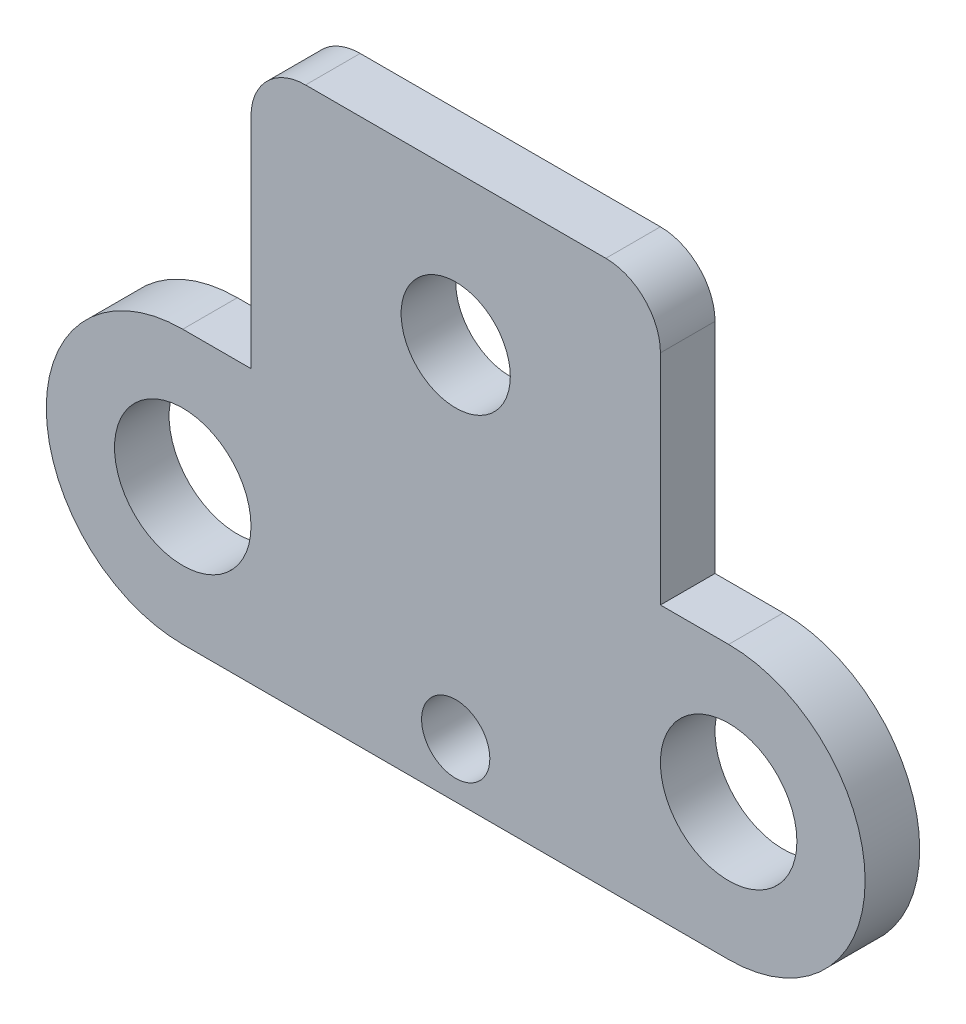
ISO-10303-21;
HEADER;
FILE_DESCRIPTION(('STEP AP214'),'2;1');
FILE_NAME('part.step','',(''),(''),'','','');
FILE_SCHEMA(('AUTOMOTIVE_DESIGN { 1 0 10303 214 1 1 1 1 }'));
ENDSEC;
DATA;
#1=APPLICATION_CONTEXT('core data for automotive mechanical design processes');
#2=APPLICATION_PROTOCOL_DEFINITION('international standard','automotive_design',2000,#1);
#3=PRODUCT_CONTEXT('',#1,'mechanical');
#4=PRODUCT('Part','Part','',(#3));
#5=PRODUCT_RELATED_PRODUCT_CATEGORY('part','',(#4));
#6=PRODUCT_DEFINITION_FORMATION('','',#4);
#7=PRODUCT_DEFINITION_CONTEXT('part definition',#1,'design');
#8=PRODUCT_DEFINITION('design','',#6,#7);
#9=PRODUCT_DEFINITION_SHAPE('','',#8);
#10=(LENGTH_UNIT() NAMED_UNIT(*) SI_UNIT(.MILLI.,.METRE.));
#11=(NAMED_UNIT(*) PLANE_ANGLE_UNIT() SI_UNIT($,.RADIAN.));
#12=(NAMED_UNIT(*) SI_UNIT($,.STERADIAN.) SOLID_ANGLE_UNIT());
#13=UNCERTAINTY_MEASURE_WITH_UNIT(LENGTH_MEASURE(1.E-05),#10,'distance_accuracy_value','');
#14=(GEOMETRIC_REPRESENTATION_CONTEXT(3) GLOBAL_UNCERTAINTY_ASSIGNED_CONTEXT((#13)) GLOBAL_UNIT_ASSIGNED_CONTEXT((#10,
#11,#12)) REPRESENTATION_CONTEXT('',''));
#15=CARTESIAN_POINT('',(0.,0.,0.));
#16=DIRECTION('',(0.,0.,1.));
#17=DIRECTION('',(1.,0.,0.));
#18=AXIS2_PLACEMENT_3D('',#15,#16,#17);
#19=CARTESIAN_POINT('',(0.,5.,1.));
#20=DIRECTION('',(0.,-1.,0.));
#21=DIRECTION('',(0.,0.,-1.));
#22=AXIS2_PLACEMENT_3D('',#19,#20,#21);
#23=PLANE('',#22);
#24=DIRECTION('',(0.,0.,-1.));
#25=VECTOR('',#24,1.);
#26=CARTESIAN_POINT('',(2.5,5.,1.));
#27=LINE('',#26,#25);
#28=CARTESIAN_POINT('',(2.5,5.,1.));
#29=VERTEX_POINT('',#28);
#30=CARTESIAN_POINT('',(2.5,5.,-1.));
#31=VERTEX_POINT('',#30);
#32=EDGE_CURVE('E134',#29,#31,#27,.T.);
#33=ORIENTED_EDGE('',*,*,#32,.T.);
#34=DIRECTION('',(-1.,0.,0.));
#35=VECTOR('',#34,1.);
#36=CARTESIAN_POINT('',(0.,5.,-1.));
#37=LINE('',#36,#35);
#38=CARTESIAN_POINT('',(0.,5.,-1.));
#39=VERTEX_POINT('',#38);
#40=EDGE_CURVE('E129',#31,#39,#37,.T.);
#41=ORIENTED_EDGE('',*,*,#40,.T.);
#42=DIRECTION('',(0.,0.,-1.));
#43=VECTOR('',#42,1.);
#44=CARTESIAN_POINT('',(0.,5.,1.));
#45=LINE('',#44,#43);
#46=CARTESIAN_POINT('',(0.,5.,1.));
#47=VERTEX_POINT('',#46);
#48=EDGE_CURVE('E181',#47,#39,#45,.T.);
#49=ORIENTED_EDGE('',*,*,#48,.F.);
#50=DIRECTION('',(-1.,0.,0.));
#51=VECTOR('',#50,1.);
#52=CARTESIAN_POINT('',(0.,5.,1.));
#53=LINE('',#52,#51);
#54=EDGE_CURVE('E178',#29,#47,#53,.T.);
#55=ORIENTED_EDGE('',*,*,#54,.F.);
#56=EDGE_LOOP('',(#33,#41,#49,#55));
#57=FACE_BOUND('',#56,.T.);
#58=ADVANCED_FACE('F37',(#57),#23,.F.);
#59=DIRECTION('',(0.,0.,-1.));
#60=VECTOR('',#59,1.);
#61=CARTESIAN_POINT('',(17.5,5.,1.));
#62=LINE('',#61,#60);
#63=CARTESIAN_POINT('',(17.5,5.,1.));
#64=VERTEX_POINT('',#63);
#65=CARTESIAN_POINT('',(17.5,5.,-1.));
#66=VERTEX_POINT('',#65);
#67=EDGE_CURVE('E121',#64,#66,#62,.T.);
#68=ORIENTED_EDGE('',*,*,#67,.F.);
#69=CARTESIAN_POINT('',(20.,5.,1.));
#70=VERTEX_POINT('',#69);
#71=EDGE_CURVE('E179',#70,#64,#53,.T.);
#72=ORIENTED_EDGE('',*,*,#71,.F.);
#73=DIRECTION('',(0.,0.,-1.));
#74=VECTOR('',#73,1.);
#75=CARTESIAN_POINT('',(20.,5.,1.));
#76=LINE('',#75,#74);
#77=CARTESIAN_POINT('',(20.,5.,-1.));
#78=VERTEX_POINT('',#77);
#79=EDGE_CURVE('E124',#70,#78,#76,.T.);
#80=ORIENTED_EDGE('',*,*,#79,.T.);
#81=EDGE_CURVE('E117',#78,#66,#37,.T.);
#82=ORIENTED_EDGE('',*,*,#81,.T.);
#83=EDGE_LOOP('',(#68,#72,#80,#82));
#84=FACE_BOUND('',#83,.T.);
#85=ADVANCED_FACE('F119',(#84),#23,.F.);
#86=CARTESIAN_POINT('',(0.,0.,1.));
#87=DIRECTION('',(0.,0.,1.));
#88=DIRECTION('',(1.,0.,0.));
#89=AXIS2_PLACEMENT_3D('',#86,#87,#88);
#90=PLANE('',#89);
#91=CARTESIAN_POINT('',(20.,0.,1.));
#92=DIRECTION('',(0.,0.,1.));
#93=DIRECTION('',(1.,0.,0.));
#94=AXIS2_PLACEMENT_3D('',#91,#92,#93);
#95=CIRCLE('',#94,2.5);
#96=CARTESIAN_POINT('',(22.5,0.,1.));
#97=VERTEX_POINT('',#96);
#98=EDGE_CURVE('E160',#97,#97,#95,.T.);
#99=ORIENTED_EDGE('',*,*,#98,.F.);
#100=EDGE_LOOP('',(#99));
#101=FACE_BOUND('',#100,.T.);
#102=DIRECTION('',(0.,1.,0.));
#103=VECTOR('',#102,1.);
#104=CARTESIAN_POINT('',(17.5,5.,1.));
#105=LINE('',#104,#103);
#106=CARTESIAN_POINT('',(17.5,13.,1.));
#107=VERTEX_POINT('',#106);
#108=EDGE_CURVE('E133',#64,#107,#105,.T.);
#109=ORIENTED_EDGE('',*,*,#108,.T.);
#110=CARTESIAN_POINT('',(15.5,13.,1.));
#111=DIRECTION('',(0.,0.,1.));
#112=DIRECTION('',(1.,0.,0.));
#113=AXIS2_PLACEMENT_3D('',#110,#111,#112);
#114=CIRCLE('',#113,2.);
#115=CARTESIAN_POINT('',(15.5,15.,1.));
#116=VERTEX_POINT('',#115);
#117=EDGE_CURVE('E45',#107,#116,#114,.T.);
#118=ORIENTED_EDGE('',*,*,#117,.T.);
#119=DIRECTION('',(-1.,0.,0.));
#120=VECTOR('',#119,1.);
#121=CARTESIAN_POINT('',(2.5,15.,1.));
#122=LINE('',#121,#120);
#123=CARTESIAN_POINT('',(4.5,15.,1.));
#124=VERTEX_POINT('',#123);
#125=EDGE_CURVE('E135',#116,#124,#122,.T.);
#126=ORIENTED_EDGE('',*,*,#125,.T.);
#127=CARTESIAN_POINT('',(4.5,13.,1.));
#128=DIRECTION('',(0.,0.,1.));
#129=DIRECTION('',(1.,0.,0.));
#130=AXIS2_PLACEMENT_3D('',#127,#128,#129);
#131=CIRCLE('',#130,2.);
#132=CARTESIAN_POINT('',(2.5,13.,1.));
#133=VERTEX_POINT('',#132);
#134=EDGE_CURVE('E52',#124,#133,#131,.T.);
#135=ORIENTED_EDGE('',*,*,#134,.T.);
#136=DIRECTION('',(0.,-1.,0.));
#137=VECTOR('',#136,1.);
#138=CARTESIAN_POINT('',(2.5,5.,1.));
#139=LINE('',#138,#137);
#140=EDGE_CURVE('E145',#133,#29,#139,.T.);
#141=ORIENTED_EDGE('',*,*,#140,.T.);
#142=ORIENTED_EDGE('',*,*,#54,.T.);
#143=CARTESIAN_POINT('',(0.,0.,1.));
#144=DIRECTION('',(0.,0.,1.));
#145=DIRECTION('',(1.,0.,0.));
#146=AXIS2_PLACEMENT_3D('',#143,#144,#145);
#147=CIRCLE('',#146,5.);
#148=CARTESIAN_POINT('',(0.,-5.,1.));
#149=VERTEX_POINT('',#148);
#150=EDGE_CURVE('E128',#47,#149,#147,.T.);
#151=ORIENTED_EDGE('',*,*,#150,.T.);
#152=DIRECTION('',(1.,0.,0.));
#153=VECTOR('',#152,1.);
#154=CARTESIAN_POINT('',(0.,-5.,1.));
#155=LINE('',#154,#153);
#156=CARTESIAN_POINT('',(20.,-5.,1.));
#157=VERTEX_POINT('',#156);
#158=EDGE_CURVE('E174',#149,#157,#155,.T.);
#159=ORIENTED_EDGE('',*,*,#158,.T.);
#160=CARTESIAN_POINT('',(20.,0.,1.));
#161=DIRECTION('',(0.,0.,1.));
#162=DIRECTION('',(1.,0.,0.));
#163=AXIS2_PLACEMENT_3D('',#160,#161,#162);
#164=CIRCLE('',#163,5.);
#165=EDGE_CURVE('E176',#157,#70,#164,.T.);
#166=ORIENTED_EDGE('',*,*,#165,.T.);
#167=ORIENTED_EDGE('',*,*,#71,.T.);
#168=EDGE_LOOP('',(#109,#118,#126,#135,#141,#142,#151,#159,#166,#167));
#169=FACE_BOUND('',#168,.T.);
#170=CARTESIAN_POINT('',(0.,0.,1.));
#171=DIRECTION('',(0.,0.,1.));
#172=DIRECTION('',(1.,0.,0.));
#173=AXIS2_PLACEMENT_3D('',#170,#171,#172);
#174=CIRCLE('',#173,2.5);
#175=CARTESIAN_POINT('',(2.5,0.,1.));
#176=VERTEX_POINT('',#175);
#177=EDGE_CURVE('E166',#176,#176,#174,.T.);
#178=ORIENTED_EDGE('',*,*,#177,.F.);
#179=EDGE_LOOP('',(#178));
#180=FACE_BOUND('',#179,.T.);
#181=CARTESIAN_POINT('',(10.,-3.,1.));
#182=DIRECTION('',(0.,0.,1.));
#183=DIRECTION('',(1.,0.,0.));
#184=AXIS2_PLACEMENT_3D('',#181,#182,#183);
#185=CIRCLE('',#184,1.25);
#186=CARTESIAN_POINT('',(11.25,-3.,1.));
#187=VERTEX_POINT('',#186);
#188=EDGE_CURVE('E154',#187,#187,#185,.T.);
#189=ORIENTED_EDGE('',*,*,#188,.F.);
#190=EDGE_LOOP('',(#189));
#191=FACE_BOUND('',#190,.T.);
#192=CARTESIAN_POINT('',(10.,9.5,1.));
#193=DIRECTION('',(0.,0.,1.));
#194=DIRECTION('',(1.,0.,0.));
#195=AXIS2_PLACEMENT_3D('',#192,#193,#194);
#196=CIRCLE('',#195,2.);
#197=CARTESIAN_POINT('',(12.,9.5,1.));
#198=VERTEX_POINT('',#197);
#199=EDGE_CURVE('E147',#198,#198,#196,.T.);
#200=ORIENTED_EDGE('',*,*,#199,.F.);
#201=EDGE_LOOP('',(#200));
#202=FACE_BOUND('',#201,.T.);
#203=ADVANCED_FACE('F208',(#101,#169,#180,#191,#202),#90,.T.);
#204=CARTESIAN_POINT('',(0.,0.,-1.));
#205=DIRECTION('',(0.,0.,1.));
#206=DIRECTION('',(1.,0.,0.));
#207=AXIS2_PLACEMENT_3D('',#204,#205,#206);
#208=PLANE('',#207);
#209=DIRECTION('',(-1.,0.,0.));
#210=VECTOR('',#209,1.);
#211=CARTESIAN_POINT('',(2.5,15.,-1.));
#212=LINE('',#211,#210);
#213=CARTESIAN_POINT('',(15.5,15.,-1.));
#214=VERTEX_POINT('',#213);
#215=CARTESIAN_POINT('',(4.5,15.,-1.));
#216=VERTEX_POINT('',#215);
#217=EDGE_CURVE('E141',#214,#216,#212,.T.);
#218=ORIENTED_EDGE('',*,*,#217,.F.);
#219=CARTESIAN_POINT('',(15.5,13.,-1.));
#220=DIRECTION('',(0.,0.,1.));
#221=DIRECTION('',(1.,0.,0.));
#222=AXIS2_PLACEMENT_3D('',#219,#220,#221);
#223=CIRCLE('',#222,2.);
#224=CARTESIAN_POINT('',(17.5,13.,-1.));
#225=VERTEX_POINT('',#224);
#226=EDGE_CURVE('E140',#214,#225,#223,.F.);
#227=ORIENTED_EDGE('',*,*,#226,.T.);
#228=DIRECTION('',(0.,1.,0.));
#229=VECTOR('',#228,1.);
#230=CARTESIAN_POINT('',(17.5,5.,-1.));
#231=LINE('',#230,#229);
#232=EDGE_CURVE('E132',#66,#225,#231,.T.);
#233=ORIENTED_EDGE('',*,*,#232,.F.);
#234=ORIENTED_EDGE('',*,*,#81,.F.);
#235=CARTESIAN_POINT('',(20.,0.,-1.));
#236=DIRECTION('',(0.,0.,1.));
#237=DIRECTION('',(1.,0.,0.));
#238=AXIS2_PLACEMENT_3D('',#235,#236,#237);
#239=CIRCLE('',#238,5.);
#240=CARTESIAN_POINT('',(20.,-5.,-1.));
#241=VERTEX_POINT('',#240);
#242=EDGE_CURVE('E186',#241,#78,#239,.T.);
#243=ORIENTED_EDGE('',*,*,#242,.F.);
#244=DIRECTION('',(1.,0.,0.));
#245=VECTOR('',#244,1.);
#246=CARTESIAN_POINT('',(0.,-5.,-1.));
#247=LINE('',#246,#245);
#248=CARTESIAN_POINT('',(0.,-5.,-1.));
#249=VERTEX_POINT('',#248);
#250=EDGE_CURVE('E184',#249,#241,#247,.T.);
#251=ORIENTED_EDGE('',*,*,#250,.F.);
#252=CARTESIAN_POINT('',(0.,0.,-1.));
#253=DIRECTION('',(0.,0.,1.));
#254=DIRECTION('',(1.,0.,0.));
#255=AXIS2_PLACEMENT_3D('',#252,#253,#254);
#256=CIRCLE('',#255,5.);
#257=EDGE_CURVE('E169',#39,#249,#256,.T.);
#258=ORIENTED_EDGE('',*,*,#257,.F.);
#259=ORIENTED_EDGE('',*,*,#40,.F.);
#260=DIRECTION('',(0.,-1.,0.));
#261=VECTOR('',#260,1.);
#262=CARTESIAN_POINT('',(2.5,5.,-1.));
#263=LINE('',#262,#261);
#264=CARTESIAN_POINT('',(2.5,13.,-1.));
#265=VERTEX_POINT('',#264);
#266=EDGE_CURVE('E142',#265,#31,#263,.T.);
#267=ORIENTED_EDGE('',*,*,#266,.F.);
#268=CARTESIAN_POINT('',(4.5,13.,-1.));
#269=DIRECTION('',(0.,0.,1.));
#270=DIRECTION('',(1.,0.,0.));
#271=AXIS2_PLACEMENT_3D('',#268,#269,#270);
#272=CIRCLE('',#271,2.);
#273=EDGE_CURVE('E202',#265,#216,#272,.F.);
#274=ORIENTED_EDGE('',*,*,#273,.T.);
#275=EDGE_LOOP('',(#218,#227,#233,#234,#243,#251,#258,#259,#267,#274));
#276=FACE_BOUND('',#275,.T.);
#277=CARTESIAN_POINT('',(0.,0.,-1.));
#278=DIRECTION('',(0.,0.,1.));
#279=DIRECTION('',(1.,0.,0.));
#280=AXIS2_PLACEMENT_3D('',#277,#278,#279);
#281=CIRCLE('',#280,2.5);
#282=CARTESIAN_POINT('',(2.5,0.,-1.));
#283=VERTEX_POINT('',#282);
#284=EDGE_CURVE('E163',#283,#283,#281,.T.);
#285=ORIENTED_EDGE('',*,*,#284,.T.);
#286=EDGE_LOOP('',(#285));
#287=FACE_BOUND('',#286,.T.);
#288=CARTESIAN_POINT('',(20.,0.,-1.));
#289=DIRECTION('',(0.,0.,1.));
#290=DIRECTION('',(1.,0.,0.));
#291=AXIS2_PLACEMENT_3D('',#288,#289,#290);
#292=CIRCLE('',#291,2.5);
#293=CARTESIAN_POINT('',(22.5,0.,-1.));
#294=VERTEX_POINT('',#293);
#295=EDGE_CURVE('E157',#294,#294,#292,.T.);
#296=ORIENTED_EDGE('',*,*,#295,.T.);
#297=EDGE_LOOP('',(#296));
#298=FACE_BOUND('',#297,.T.);
#299=CARTESIAN_POINT('',(10.,-3.,-1.));
#300=DIRECTION('',(0.,0.,1.));
#301=DIRECTION('',(1.,0.,0.));
#302=AXIS2_PLACEMENT_3D('',#299,#300,#301);
#303=CIRCLE('',#302,1.25);
#304=CARTESIAN_POINT('',(11.25,-3.,-1.));
#305=VERTEX_POINT('',#304);
#306=EDGE_CURVE('E153',#305,#305,#303,.T.);
#307=ORIENTED_EDGE('',*,*,#306,.T.);
#308=EDGE_LOOP('',(#307));
#309=FACE_BOUND('',#308,.T.);
#310=CARTESIAN_POINT('',(10.,9.5,-1.));
#311=DIRECTION('',(0.,0.,1.));
#312=DIRECTION('',(1.,0.,0.));
#313=AXIS2_PLACEMENT_3D('',#310,#311,#312);
#314=CIRCLE('',#313,2.);
#315=CARTESIAN_POINT('',(12.,9.5,-1.));
#316=VERTEX_POINT('',#315);
#317=EDGE_CURVE('E265',#316,#316,#314,.T.);
#318=ORIENTED_EDGE('',*,*,#317,.T.);
#319=EDGE_LOOP('',(#318));
#320=FACE_BOUND('',#319,.T.);
#321=ADVANCED_FACE('F138',(#276,#287,#298,#309,#320),#208,.F.);
#322=CARTESIAN_POINT('',(0.,0.,1.));
#323=DIRECTION('',(0.,0.,-1.));
#324=DIRECTION('',(-1.,0.,0.));
#325=AXIS2_PLACEMENT_3D('',#322,#323,#324);
#326=CYLINDRICAL_SURFACE('',#325,5.);
#327=ORIENTED_EDGE('',*,*,#257,.T.);
#328=DIRECTION('',(0.,0.,-1.));
#329=VECTOR('',#328,1.);
#330=CARTESIAN_POINT('',(0.,-5.,1.));
#331=LINE('',#330,#329);
#332=EDGE_CURVE('E194',#149,#249,#331,.T.);
#333=ORIENTED_EDGE('',*,*,#332,.F.);
#334=ORIENTED_EDGE('',*,*,#150,.F.);
#335=ORIENTED_EDGE('',*,*,#48,.T.);
#336=EDGE_LOOP('',(#327,#333,#334,#335));
#337=FACE_BOUND('',#336,.T.);
#338=ADVANCED_FACE('F242',(#337),#326,.T.);
#339=CARTESIAN_POINT('',(0.,-5.,1.));
#340=DIRECTION('',(0.,1.,0.));
#341=DIRECTION('',(0.,0.,1.));
#342=AXIS2_PLACEMENT_3D('',#339,#340,#341);
#343=PLANE('',#342);
#344=ORIENTED_EDGE('',*,*,#250,.T.);
#345=DIRECTION('',(0.,0.,-1.));
#346=VECTOR('',#345,1.);
#347=CARTESIAN_POINT('',(20.,-5.,1.));
#348=LINE('',#347,#346);
#349=EDGE_CURVE('E191',#157,#241,#348,.T.);
#350=ORIENTED_EDGE('',*,*,#349,.F.);
#351=ORIENTED_EDGE('',*,*,#158,.F.);
#352=ORIENTED_EDGE('',*,*,#332,.T.);
#353=EDGE_LOOP('',(#344,#350,#351,#352));
#354=FACE_BOUND('',#353,.T.);
#355=ADVANCED_FACE('F239',(#354),#343,.F.);
#356=CARTESIAN_POINT('',(20.,0.,1.));
#357=DIRECTION('',(0.,0.,-1.));
#358=DIRECTION('',(-1.,0.,0.));
#359=AXIS2_PLACEMENT_3D('',#356,#357,#358);
#360=CYLINDRICAL_SURFACE('',#359,5.);
#361=ORIENTED_EDGE('',*,*,#242,.T.);
#362=ORIENTED_EDGE('',*,*,#79,.F.);
#363=ORIENTED_EDGE('',*,*,#165,.F.);
#364=ORIENTED_EDGE('',*,*,#349,.T.);
#365=EDGE_LOOP('',(#361,#362,#363,#364));
#366=FACE_BOUND('',#365,.T.);
#367=ADVANCED_FACE('F235',(#366),#360,.T.);
#368=CARTESIAN_POINT('',(0.,0.,1.));
#369=DIRECTION('',(0.,0.,-1.));
#370=DIRECTION('',(-1.,0.,0.));
#371=AXIS2_PLACEMENT_3D('',#368,#369,#370);
#372=CYLINDRICAL_SURFACE('',#371,2.5);
#373=ORIENTED_EDGE('',*,*,#177,.T.);
#374=EDGE_LOOP('',(#373));
#375=FACE_BOUND('',#374,.T.);
#376=ORIENTED_EDGE('',*,*,#284,.F.);
#377=EDGE_LOOP('',(#376));
#378=FACE_BOUND('',#377,.T.);
#379=ADVANCED_FACE('F238',(#375,#378),#372,.F.);
#380=CARTESIAN_POINT('',(20.,0.,1.));
#381=DIRECTION('',(0.,0.,-1.));
#382=DIRECTION('',(-1.,0.,0.));
#383=AXIS2_PLACEMENT_3D('',#380,#381,#382);
#384=CYLINDRICAL_SURFACE('',#383,2.5);
#385=ORIENTED_EDGE('',*,*,#98,.T.);
#386=EDGE_LOOP('',(#385));
#387=FACE_BOUND('',#386,.T.);
#388=ORIENTED_EDGE('',*,*,#295,.F.);
#389=EDGE_LOOP('',(#388));
#390=FACE_BOUND('',#389,.T.);
#391=ADVANCED_FACE('F280',(#387,#390),#384,.F.);
#392=CARTESIAN_POINT('',(10.,-3.,1.));
#393=DIRECTION('',(0.,0.,-1.));
#394=DIRECTION('',(-1.,0.,0.));
#395=AXIS2_PLACEMENT_3D('',#392,#393,#394);
#396=CYLINDRICAL_SURFACE('',#395,1.25);
#397=ORIENTED_EDGE('',*,*,#188,.T.);
#398=EDGE_LOOP('',(#397));
#399=FACE_BOUND('',#398,.T.);
#400=ORIENTED_EDGE('',*,*,#306,.F.);
#401=EDGE_LOOP('',(#400));
#402=FACE_BOUND('',#401,.T.);
#403=ADVANCED_FACE('F284',(#399,#402),#396,.F.);
#404=CARTESIAN_POINT('',(2.5,5.,1.));
#405=DIRECTION('',(1.,0.,0.));
#406=DIRECTION('',(0.,0.,-1.));
#407=AXIS2_PLACEMENT_3D('',#404,#405,#406);
#408=PLANE('',#407);
#409=ORIENTED_EDGE('',*,*,#140,.F.);
#410=DIRECTION('',(0.,0.,-1.));
#411=VECTOR('',#410,1.);
#412=CARTESIAN_POINT('',(2.5,13.,1.));
#413=LINE('',#412,#411);
#414=EDGE_CURVE('E11',#133,#265,#413,.T.);
#415=ORIENTED_EDGE('',*,*,#414,.T.);
#416=ORIENTED_EDGE('',*,*,#266,.T.);
#417=ORIENTED_EDGE('',*,*,#32,.F.);
#418=EDGE_LOOP('',(#409,#415,#416,#417));
#419=FACE_BOUND('',#418,.T.);
#420=ADVANCED_FACE('F260',(#419),#408,.F.);
#421=CARTESIAN_POINT('',(17.5,5.,1.));
#422=DIRECTION('',(-1.,0.,0.));
#423=DIRECTION('',(0.,0.,1.));
#424=AXIS2_PLACEMENT_3D('',#421,#422,#423);
#425=PLANE('',#424);
#426=ORIENTED_EDGE('',*,*,#232,.T.);
#427=DIRECTION('',(0.,0.,-1.));
#428=VECTOR('',#427,1.);
#429=CARTESIAN_POINT('',(17.5,13.,1.));
#430=LINE('',#429,#428);
#431=EDGE_CURVE('E60',#225,#107,#430,.F.);
#432=ORIENTED_EDGE('',*,*,#431,.T.);
#433=ORIENTED_EDGE('',*,*,#108,.F.);
#434=ORIENTED_EDGE('',*,*,#67,.T.);
#435=EDGE_LOOP('',(#426,#432,#433,#434));
#436=FACE_BOUND('',#435,.T.);
#437=ADVANCED_FACE('F131',(#436),#425,.F.);
#438=CARTESIAN_POINT('',(2.5,15.,1.));
#439=DIRECTION('',(0.,-1.,0.));
#440=DIRECTION('',(0.,0.,-1.));
#441=AXIS2_PLACEMENT_3D('',#438,#439,#440);
#442=PLANE('',#441);
#443=ORIENTED_EDGE('',*,*,#125,.F.);
#444=DIRECTION('',(0.,0.,-1.));
#445=VECTOR('',#444,1.);
#446=CARTESIAN_POINT('',(15.5,15.,1.));
#447=LINE('',#446,#445);
#448=EDGE_CURVE('E199',#116,#214,#447,.T.);
#449=ORIENTED_EDGE('',*,*,#448,.T.);
#450=ORIENTED_EDGE('',*,*,#217,.T.);
#451=DIRECTION('',(0.,0.,-1.));
#452=VECTOR('',#451,1.);
#453=CARTESIAN_POINT('',(4.5,15.,1.));
#454=LINE('',#453,#452);
#455=EDGE_CURVE('E197',#216,#124,#454,.F.);
#456=ORIENTED_EDGE('',*,*,#455,.T.);
#457=EDGE_LOOP('',(#443,#449,#450,#456));
#458=FACE_BOUND('',#457,.T.);
#459=ADVANCED_FACE('F213',(#458),#442,.F.);
#460=CARTESIAN_POINT('',(10.,9.5,1.));
#461=DIRECTION('',(0.,0.,-1.));
#462=DIRECTION('',(-1.,0.,0.));
#463=AXIS2_PLACEMENT_3D('',#460,#461,#462);
#464=CYLINDRICAL_SURFACE('',#463,2.);
#465=ORIENTED_EDGE('',*,*,#199,.T.);
#466=EDGE_LOOP('',(#465));
#467=FACE_BOUND('',#466,.T.);
#468=ORIENTED_EDGE('',*,*,#317,.F.);
#469=EDGE_LOOP('',(#468));
#470=FACE_BOUND('',#469,.T.);
#471=ADVANCED_FACE('F217',(#467,#470),#464,.F.);
#472=CARTESIAN_POINT('',(15.5,13.,1.));
#473=DIRECTION('',(0.,0.,-1.));
#474=DIRECTION('',(-1.,0.,0.));
#475=AXIS2_PLACEMENT_3D('',#472,#473,#474);
#476=CYLINDRICAL_SURFACE('',#475,2.);
#477=ORIENTED_EDGE('',*,*,#117,.F.);
#478=ORIENTED_EDGE('',*,*,#431,.F.);
#479=ORIENTED_EDGE('',*,*,#226,.F.);
#480=ORIENTED_EDGE('',*,*,#448,.F.);
#481=EDGE_LOOP('',(#477,#478,#479,#480));
#482=FACE_BOUND('',#481,.T.);
#483=ADVANCED_FACE('F215',(#482),#476,.T.);
#484=CARTESIAN_POINT('',(4.5,13.,1.));
#485=DIRECTION('',(0.,0.,-1.));
#486=DIRECTION('',(-1.,0.,0.));
#487=AXIS2_PLACEMENT_3D('',#484,#485,#486);
#488=CYLINDRICAL_SURFACE('',#487,2.);
#489=ORIENTED_EDGE('',*,*,#134,.F.);
#490=ORIENTED_EDGE('',*,*,#455,.F.);
#491=ORIENTED_EDGE('',*,*,#273,.F.);
#492=ORIENTED_EDGE('',*,*,#414,.F.);
#493=EDGE_LOOP('',(#489,#490,#491,#492));
#494=FACE_BOUND('',#493,.T.);
#495=ADVANCED_FACE('F39',(#494),#488,.T.);
#496=CLOSED_SHELL('',(#58,#85,#203,#321,#338,#355,#367,#379,#391,#403,#420,#437,#459,#471,#483,#495));
#497=MANIFOLD_SOLID_BREP('B2',#496);
#498=ADVANCED_BREP_SHAPE_REPRESENTATION('',(#18,#497),#14);
#499=SHAPE_DEFINITION_REPRESENTATION(#9,#498);
ENDSEC;
END-ISO-10303-21;
